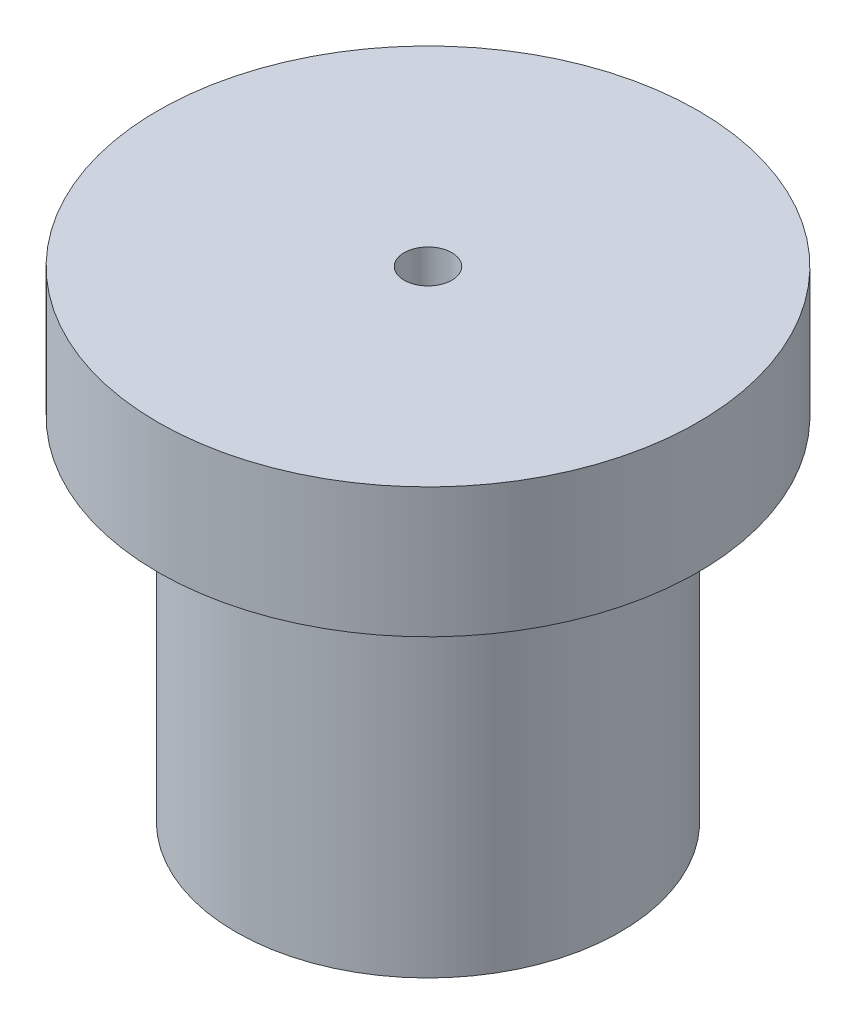
ISO-10303-21;
HEADER;
FILE_DESCRIPTION(('STEP AP214'),'2;1');
FILE_NAME('part.step','',(''),(''),'','','');
FILE_SCHEMA(('AUTOMOTIVE_DESIGN { 1 0 10303 214 1 1 1 1 }'));
ENDSEC;
DATA;
#1=APPLICATION_CONTEXT('core data for automotive mechanical design processes');
#2=APPLICATION_PROTOCOL_DEFINITION('international standard','automotive_design',2000,#1);
#3=PRODUCT_CONTEXT('',#1,'mechanical');
#4=PRODUCT('Part','Part','',(#3));
#5=PRODUCT_RELATED_PRODUCT_CATEGORY('part','',(#4));
#6=PRODUCT_DEFINITION_FORMATION('','',#4);
#7=PRODUCT_DEFINITION_CONTEXT('part definition',#1,'design');
#8=PRODUCT_DEFINITION('design','',#6,#7);
#9=PRODUCT_DEFINITION_SHAPE('','',#8);
#10=(LENGTH_UNIT() NAMED_UNIT(*) SI_UNIT(.MILLI.,.METRE.));
#11=(NAMED_UNIT(*) PLANE_ANGLE_UNIT() SI_UNIT($,.RADIAN.));
#12=(NAMED_UNIT(*) SI_UNIT($,.STERADIAN.) SOLID_ANGLE_UNIT());
#13=UNCERTAINTY_MEASURE_WITH_UNIT(LENGTH_MEASURE(1.E-05),#10,'distance_accuracy_value','');
#14=(GEOMETRIC_REPRESENTATION_CONTEXT(3) GLOBAL_UNCERTAINTY_ASSIGNED_CONTEXT((#13)) GLOBAL_UNIT_ASSIGNED_CONTEXT((#10,
#11,#12)) REPRESENTATION_CONTEXT('',''));
#15=CARTESIAN_POINT('',(0.,0.,0.));
#16=DIRECTION('',(0.,0.,1.));
#17=DIRECTION('',(1.,0.,0.));
#18=AXIS2_PLACEMENT_3D('',#15,#16,#17);
#19=CARTESIAN_POINT('',(0.,0.,0.));
#20=DIRECTION('',(0.,1.,0.));
#21=DIRECTION('',(0.,0.,1.));
#22=AXIS2_PLACEMENT_3D('',#19,#20,#21);
#23=PLANE('',#22);
#24=CARTESIAN_POINT('',(0.,0.,0.));
#25=DIRECTION('',(0.,1.,0.));
#26=DIRECTION('',(0.,0.,1.));
#27=AXIS2_PLACEMENT_3D('',#24,#25,#26);
#28=CIRCLE('',#27,9.398);
#29=CARTESIAN_POINT('',(0.,0.,9.398));
#30=VERTEX_POINT('',#29);
#31=EDGE_CURVE('E47',#30,#30,#28,.T.);
#32=ORIENTED_EDGE('',*,*,#31,.F.);
#33=EDGE_LOOP('',(#32));
#34=FACE_BOUND('',#33,.T.);
#35=CARTESIAN_POINT('',(0.,0.,0.));
#36=DIRECTION('',(0.,1.,0.));
#37=DIRECTION('',(0.,0.,1.));
#38=AXIS2_PLACEMENT_3D('',#35,#36,#37);
#39=CIRCLE('',#38,1.1684);
#40=CARTESIAN_POINT('',(0.,0.,1.1684));
#41=VERTEX_POINT('',#40);
#42=EDGE_CURVE('E56',#41,#41,#39,.T.);
#43=ORIENTED_EDGE('',*,*,#42,.T.);
#44=EDGE_LOOP('',(#43));
#45=FACE_BOUND('',#44,.T.);
#46=ADVANCED_FACE('F43',(#34,#45),#23,.F.);
#47=CARTESIAN_POINT('',(0.,17.145,0.));
#48=DIRECTION('',(0.,-1.,0.));
#49=DIRECTION('',(0.,0.,-1.));
#50=AXIS2_PLACEMENT_3D('',#47,#48,#49);
#51=CYLINDRICAL_SURFACE('',#50,9.398);
#52=CARTESIAN_POINT('',(0.,17.145,0.));
#53=DIRECTION('',(0.,1.,0.));
#54=DIRECTION('',(0.,0.,1.));
#55=AXIS2_PLACEMENT_3D('',#52,#53,#54);
#56=CIRCLE('',#55,9.398);
#57=CARTESIAN_POINT('',(0.,17.145,9.398));
#58=VERTEX_POINT('',#57);
#59=EDGE_CURVE('E10',#58,#58,#56,.T.);
#60=ORIENTED_EDGE('',*,*,#59,.F.);
#61=EDGE_LOOP('',(#60));
#62=FACE_BOUND('',#61,.T.);
#63=ORIENTED_EDGE('',*,*,#31,.T.);
#64=EDGE_LOOP('',(#63));
#65=FACE_BOUND('',#64,.T.);
#66=ADVANCED_FACE('F45',(#62,#65),#51,.T.);
#67=CARTESIAN_POINT('',(0.,17.145,0.));
#68=DIRECTION('',(0.,-1.,0.));
#69=DIRECTION('',(0.,0.,-1.));
#70=AXIS2_PLACEMENT_3D('',#67,#68,#69);
#71=CYLINDRICAL_SURFACE('',#70,1.1684);
#72=ORIENTED_EDGE('',*,*,#42,.F.);
#73=EDGE_LOOP('',(#72));
#74=FACE_BOUND('',#73,.T.);
#75=CARTESIAN_POINT('',(0.,23.495,0.));
#76=DIRECTION('',(0.,1.,0.));
#77=DIRECTION('',(0.,0.,1.));
#78=AXIS2_PLACEMENT_3D('',#75,#76,#77);
#79=CIRCLE('',#78,1.1684);
#80=CARTESIAN_POINT('',(0.,23.495,1.1684));
#81=VERTEX_POINT('',#80);
#82=EDGE_CURVE('E66',#81,#81,#79,.T.);
#83=ORIENTED_EDGE('',*,*,#82,.T.);
#84=EDGE_LOOP('',(#83));
#85=FACE_BOUND('',#84,.T.);
#86=ADVANCED_FACE('F74',(#74,#85),#71,.F.);
#87=CARTESIAN_POINT('',(0.,23.495,0.));
#88=DIRECTION('',(0.,1.,0.));
#89=DIRECTION('',(0.,0.,1.));
#90=AXIS2_PLACEMENT_3D('',#87,#88,#89);
#91=PLANE('',#90);
#92=CARTESIAN_POINT('',(0.,23.495,0.));
#93=DIRECTION('',(0.,1.,0.));
#94=DIRECTION('',(0.,0.,1.));
#95=AXIS2_PLACEMENT_3D('',#92,#93,#94);
#96=CIRCLE('',#95,13.208);
#97=CARTESIAN_POINT('',(0.,23.495,13.208));
#98=VERTEX_POINT('',#97);
#99=EDGE_CURVE('E61',#98,#98,#96,.T.);
#100=ORIENTED_EDGE('',*,*,#99,.T.);
#101=EDGE_LOOP('',(#100));
#102=FACE_BOUND('',#101,.T.);
#103=ORIENTED_EDGE('',*,*,#82,.F.);
#104=EDGE_LOOP('',(#103));
#105=FACE_BOUND('',#104,.T.);
#106=ADVANCED_FACE('F76',(#102,#105),#91,.T.);
#107=CARTESIAN_POINT('',(0.,17.145,0.));
#108=DIRECTION('',(0.,1.,0.));
#109=DIRECTION('',(0.,0.,1.));
#110=AXIS2_PLACEMENT_3D('',#107,#108,#109);
#111=PLANE('',#110);
#112=ORIENTED_EDGE('',*,*,#59,.T.);
#113=EDGE_LOOP('',(#112));
#114=FACE_BOUND('',#113,.T.);
#115=CARTESIAN_POINT('',(0.,17.145,0.));
#116=DIRECTION('',(0.,1.,0.));
#117=DIRECTION('',(0.,0.,1.));
#118=AXIS2_PLACEMENT_3D('',#115,#116,#117);
#119=CIRCLE('',#118,13.208);
#120=CARTESIAN_POINT('',(0.,17.145,13.208));
#121=VERTEX_POINT('',#120);
#122=EDGE_CURVE('E62',#121,#121,#119,.T.);
#123=ORIENTED_EDGE('',*,*,#122,.F.);
#124=EDGE_LOOP('',(#123));
#125=FACE_BOUND('',#124,.T.);
#126=ADVANCED_FACE('F78',(#114,#125),#111,.F.);
#127=CARTESIAN_POINT('',(0.,23.495,0.));
#128=DIRECTION('',(0.,-1.,0.));
#129=DIRECTION('',(0.,0.,-1.));
#130=AXIS2_PLACEMENT_3D('',#127,#128,#129);
#131=CYLINDRICAL_SURFACE('',#130,13.208);
#132=ORIENTED_EDGE('',*,*,#99,.F.);
#133=EDGE_LOOP('',(#132));
#134=FACE_BOUND('',#133,.T.);
#135=ORIENTED_EDGE('',*,*,#122,.T.);
#136=EDGE_LOOP('',(#135));
#137=FACE_BOUND('',#136,.T.);
#138=ADVANCED_FACE('F85',(#134,#137),#131,.T.);
#139=CLOSED_SHELL('',(#46,#66,#86,#106,#126,#138));
#140=MANIFOLD_SOLID_BREP('B2',#139);
#141=ADVANCED_BREP_SHAPE_REPRESENTATION('',(#18,#140),#14);
#142=SHAPE_DEFINITION_REPRESENTATION(#9,#141);
ENDSEC;
END-ISO-10303-21;
